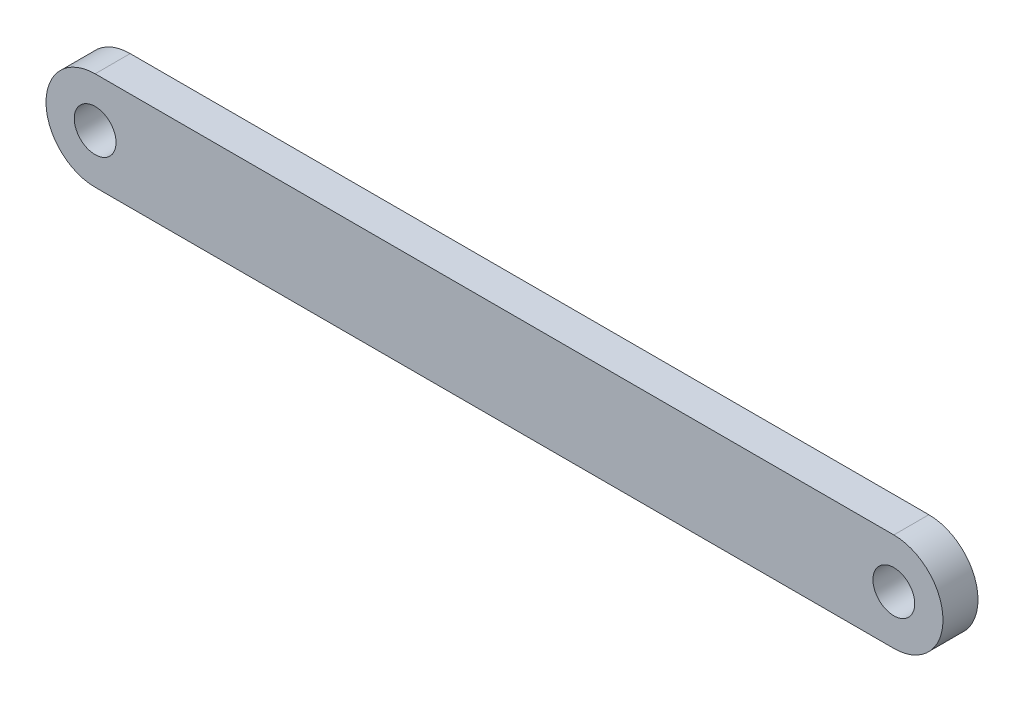
ISO-10303-21;
HEADER;
FILE_DESCRIPTION(('STEP AP214'),'2;1');
FILE_NAME('part.step','',(''),(''),'','','');
FILE_SCHEMA(('AUTOMOTIVE_DESIGN { 1 0 10303 214 1 1 1 1 }'));
ENDSEC;
DATA;
#1=APPLICATION_CONTEXT('core data for automotive mechanical design processes');
#2=APPLICATION_PROTOCOL_DEFINITION('international standard','automotive_design',2000,#1);
#3=PRODUCT_CONTEXT('',#1,'mechanical');
#4=PRODUCT('Part','Part','',(#3));
#5=PRODUCT_RELATED_PRODUCT_CATEGORY('part','',(#4));
#6=PRODUCT_DEFINITION_FORMATION('','',#4);
#7=PRODUCT_DEFINITION_CONTEXT('part definition',#1,'design');
#8=PRODUCT_DEFINITION('design','',#6,#7);
#9=PRODUCT_DEFINITION_SHAPE('','',#8);
#10=(LENGTH_UNIT() NAMED_UNIT(*) SI_UNIT(.MILLI.,.METRE.));
#11=(NAMED_UNIT(*) PLANE_ANGLE_UNIT() SI_UNIT($,.RADIAN.));
#12=(NAMED_UNIT(*) SI_UNIT($,.STERADIAN.) SOLID_ANGLE_UNIT());
#13=UNCERTAINTY_MEASURE_WITH_UNIT(LENGTH_MEASURE(1.E-05),#10,'distance_accuracy_value','');
#14=(GEOMETRIC_REPRESENTATION_CONTEXT(3) GLOBAL_UNCERTAINTY_ASSIGNED_CONTEXT((#13)) GLOBAL_UNIT_ASSIGNED_CONTEXT((#10,
#11,#12)) REPRESENTATION_CONTEXT('',''));
#15=CARTESIAN_POINT('',(0.,0.,0.));
#16=DIRECTION('',(0.,0.,1.));
#17=DIRECTION('',(1.,0.,0.));
#18=AXIS2_PLACEMENT_3D('',#15,#16,#17);
#19=CARTESIAN_POINT('',(-50.,4.,2.85));
#20=DIRECTION('',(0.,-1.,0.));
#21=DIRECTION('',(0.,0.,-1.));
#22=AXIS2_PLACEMENT_3D('',#19,#20,#21);
#23=PLANE('',#22);
#24=DIRECTION('',(0.,0.,1.));
#25=VECTOR('',#24,1.);
#26=CARTESIAN_POINT('',(-19.,4.,0.));
#27=LINE('',#26,#25);
#28=CARTESIAN_POINT('',(-19.,4.,0.));
#29=VERTEX_POINT('',#28);
#30=CARTESIAN_POINT('',(-19.,4.,2.85));
#31=VERTEX_POINT('',#30);
#32=EDGE_CURVE('E85',#29,#31,#27,.T.);
#33=ORIENTED_EDGE('',*,*,#32,.T.);
#34=DIRECTION('',(-1.,0.,0.));
#35=VECTOR('',#34,1.);
#36=CARTESIAN_POINT('',(-50.,4.,2.85));
#37=LINE('',#36,#35);
#38=CARTESIAN_POINT('',(46.,4.,2.85));
#39=VERTEX_POINT('',#38);
#40=EDGE_CURVE('E72',#39,#31,#37,.T.);
#41=ORIENTED_EDGE('',*,*,#40,.F.);
#42=DIRECTION('',(0.,0.,1.));
#43=VECTOR('',#42,1.);
#44=CARTESIAN_POINT('',(46.,4.,0.));
#45=LINE('',#44,#43);
#46=CARTESIAN_POINT('',(46.,4.,0.));
#47=VERTEX_POINT('',#46);
#48=EDGE_CURVE('E78',#47,#39,#45,.T.);
#49=ORIENTED_EDGE('',*,*,#48,.F.);
#50=DIRECTION('',(-1.,0.,0.));
#51=VECTOR('',#50,1.);
#52=CARTESIAN_POINT('',(-50.,4.,0.));
#53=LINE('',#52,#51);
#54=EDGE_CURVE('E83',#47,#29,#53,.T.);
#55=ORIENTED_EDGE('',*,*,#54,.T.);
#56=EDGE_LOOP('',(#33,#41,#49,#55));
#57=FACE_BOUND('',#56,.T.);
#58=ADVANCED_FACE('F33',(#57),#23,.F.);
#59=CARTESIAN_POINT('',(0.,0.,2.85));
#60=DIRECTION('',(0.,0.,1.));
#61=DIRECTION('',(1.,0.,0.));
#62=AXIS2_PLACEMENT_3D('',#59,#60,#61);
#63=PLANE('',#62);
#64=CARTESIAN_POINT('',(-19.,0.,2.85));
#65=DIRECTION('',(0.,0.,-1.));
#66=DIRECTION('',(1.,0.,0.));
#67=AXIS2_PLACEMENT_3D('',#64,#65,#66);
#68=CIRCLE('',#67,4.);
#69=CARTESIAN_POINT('',(-19.,-4.,2.85));
#70=VERTEX_POINT('',#69);
#71=EDGE_CURVE('E47',#70,#31,#68,.T.);
#72=ORIENTED_EDGE('',*,*,#71,.F.);
#73=DIRECTION('',(1.,0.,0.));
#74=VECTOR('',#73,1.);
#75=CARTESIAN_POINT('',(-50.,-4.,2.85));
#76=LINE('',#75,#74);
#77=CARTESIAN_POINT('',(46.,-4.,2.85));
#78=VERTEX_POINT('',#77);
#79=EDGE_CURVE('E40',#70,#78,#76,.T.);
#80=ORIENTED_EDGE('',*,*,#79,.T.);
#81=CARTESIAN_POINT('',(46.,0.,2.85));
#82=DIRECTION('',(0.,0.,-1.));
#83=DIRECTION('',(1.,0.,0.));
#84=AXIS2_PLACEMENT_3D('',#81,#82,#83);
#85=CIRCLE('',#84,4.);
#86=EDGE_CURVE('E68',#39,#78,#85,.T.);
#87=ORIENTED_EDGE('',*,*,#86,.F.);
#88=ORIENTED_EDGE('',*,*,#40,.T.);
#89=EDGE_LOOP('',(#72,#80,#87,#88));
#90=FACE_BOUND('',#89,.T.);
#91=CARTESIAN_POINT('',(-19.,0.,2.85));
#92=DIRECTION('',(0.,0.,1.));
#93=DIRECTION('',(1.,0.,0.));
#94=AXIS2_PLACEMENT_3D('',#91,#92,#93);
#95=CIRCLE('',#94,1.7);
#96=CARTESIAN_POINT('',(-17.3,0.,2.85));
#97=VERTEX_POINT('',#96);
#98=EDGE_CURVE('E107',#97,#97,#95,.T.);
#99=ORIENTED_EDGE('',*,*,#98,.F.);
#100=EDGE_LOOP('',(#99));
#101=FACE_BOUND('',#100,.T.);
#102=CARTESIAN_POINT('',(46.,0.,2.85));
#103=DIRECTION('',(0.,0.,1.));
#104=DIRECTION('',(1.,0.,0.));
#105=AXIS2_PLACEMENT_3D('',#102,#103,#104);
#106=CIRCLE('',#105,1.7);
#107=CARTESIAN_POINT('',(47.7,0.,2.85));
#108=VERTEX_POINT('',#107);
#109=EDGE_CURVE('E112',#108,#108,#106,.T.);
#110=ORIENTED_EDGE('',*,*,#109,.F.);
#111=EDGE_LOOP('',(#110));
#112=FACE_BOUND('',#111,.T.);
#113=ADVANCED_FACE('F69',(#90,#101,#112),#63,.T.);
#114=CARTESIAN_POINT('',(0.,0.,0.));
#115=DIRECTION('',(0.,0.,1.));
#116=DIRECTION('',(1.,0.,0.));
#117=AXIS2_PLACEMENT_3D('',#114,#115,#116);
#118=PLANE('',#117);
#119=CARTESIAN_POINT('',(-19.,0.,0.));
#120=DIRECTION('',(0.,0.,1.));
#121=DIRECTION('',(1.,0.,0.));
#122=AXIS2_PLACEMENT_3D('',#119,#120,#121);
#123=CIRCLE('',#122,1.7);
#124=CARTESIAN_POINT('',(-17.3,0.,0.));
#125=VERTEX_POINT('',#124);
#126=EDGE_CURVE('E109',#125,#125,#123,.T.);
#127=ORIENTED_EDGE('',*,*,#126,.T.);
#128=EDGE_LOOP('',(#127));
#129=FACE_BOUND('',#128,.T.);
#130=DIRECTION('',(1.,0.,0.));
#131=VECTOR('',#130,1.);
#132=CARTESIAN_POINT('',(-50.,-4.,0.));
#133=LINE('',#132,#131);
#134=CARTESIAN_POINT('',(-19.,-4.,0.));
#135=VERTEX_POINT('',#134);
#136=CARTESIAN_POINT('',(46.,-4.,0.));
#137=VERTEX_POINT('',#136);
#138=EDGE_CURVE('E86',#135,#137,#133,.T.);
#139=ORIENTED_EDGE('',*,*,#138,.F.);
#140=CARTESIAN_POINT('',(-19.,0.,0.));
#141=DIRECTION('',(0.,0.,-1.));
#142=DIRECTION('',(1.,0.,0.));
#143=AXIS2_PLACEMENT_3D('',#140,#141,#142);
#144=CIRCLE('',#143,4.);
#145=EDGE_CURVE('E100',#135,#29,#144,.T.);
#146=ORIENTED_EDGE('',*,*,#145,.T.);
#147=ORIENTED_EDGE('',*,*,#54,.F.);
#148=CARTESIAN_POINT('',(46.,0.,0.));
#149=DIRECTION('',(0.,0.,1.));
#150=DIRECTION('',(1.,0.,0.));
#151=AXIS2_PLACEMENT_3D('',#148,#149,#150);
#152=CIRCLE('',#151,4.);
#153=EDGE_CURVE('E11',#47,#137,#152,.F.);
#154=ORIENTED_EDGE('',*,*,#153,.T.);
#155=EDGE_LOOP('',(#139,#146,#147,#154));
#156=FACE_BOUND('',#155,.T.);
#157=CARTESIAN_POINT('',(46.,0.,0.));
#158=DIRECTION('',(0.,0.,1.));
#159=DIRECTION('',(1.,0.,0.));
#160=AXIS2_PLACEMENT_3D('',#157,#158,#159);
#161=CIRCLE('',#160,1.7);
#162=CARTESIAN_POINT('',(47.7,0.,0.));
#163=VERTEX_POINT('',#162);
#164=EDGE_CURVE('E76',#163,#163,#161,.T.);
#165=ORIENTED_EDGE('',*,*,#164,.T.);
#166=EDGE_LOOP('',(#165));
#167=FACE_BOUND('',#166,.T.);
#168=ADVANCED_FACE('F97',(#129,#156,#167),#118,.F.);
#169=CARTESIAN_POINT('',(-50.,-4.,2.85));
#170=DIRECTION('',(0.,1.,0.));
#171=DIRECTION('',(0.,0.,1.));
#172=AXIS2_PLACEMENT_3D('',#169,#170,#171);
#173=PLANE('',#172);
#174=ORIENTED_EDGE('',*,*,#79,.F.);
#175=DIRECTION('',(0.,0.,1.));
#176=VECTOR('',#175,1.);
#177=CARTESIAN_POINT('',(-19.,-4.,0.));
#178=LINE('',#177,#176);
#179=EDGE_CURVE('E103',#135,#70,#178,.T.);
#180=ORIENTED_EDGE('',*,*,#179,.F.);
#181=ORIENTED_EDGE('',*,*,#138,.T.);
#182=DIRECTION('',(0.,0.,1.));
#183=VECTOR('',#182,1.);
#184=CARTESIAN_POINT('',(46.,-4.,0.));
#185=LINE('',#184,#183);
#186=EDGE_CURVE('E75',#137,#78,#185,.T.);
#187=ORIENTED_EDGE('',*,*,#186,.T.);
#188=EDGE_LOOP('',(#174,#180,#181,#187));
#189=FACE_BOUND('',#188,.T.);
#190=ADVANCED_FACE('F128',(#189),#173,.F.);
#191=CARTESIAN_POINT('',(46.,0.,0.));
#192=DIRECTION('',(0.,0.,1.));
#193=DIRECTION('',(1.,0.,0.));
#194=AXIS2_PLACEMENT_3D('',#191,#192,#193);
#195=CYLINDRICAL_SURFACE('',#194,4.);
#196=ORIENTED_EDGE('',*,*,#86,.T.);
#197=ORIENTED_EDGE('',*,*,#186,.F.);
#198=ORIENTED_EDGE('',*,*,#153,.F.);
#199=ORIENTED_EDGE('',*,*,#48,.T.);
#200=EDGE_LOOP('',(#196,#197,#198,#199));
#201=FACE_BOUND('',#200,.T.);
#202=ADVANCED_FACE('F79',(#201),#195,.T.);
#203=CARTESIAN_POINT('',(46.,0.,0.));
#204=DIRECTION('',(0.,0.,1.));
#205=DIRECTION('',(1.,0.,0.));
#206=AXIS2_PLACEMENT_3D('',#203,#204,#205);
#207=CYLINDRICAL_SURFACE('',#206,1.7);
#208=ORIENTED_EDGE('',*,*,#164,.F.);
#209=EDGE_LOOP('',(#208));
#210=FACE_BOUND('',#209,.T.);
#211=ORIENTED_EDGE('',*,*,#109,.T.);
#212=EDGE_LOOP('',(#211));
#213=FACE_BOUND('',#212,.T.);
#214=ADVANCED_FACE('F120',(#210,#213),#207,.F.);
#215=CARTESIAN_POINT('',(-19.,0.,0.));
#216=DIRECTION('',(0.,0.,1.));
#217=DIRECTION('',(1.,0.,0.));
#218=AXIS2_PLACEMENT_3D('',#215,#216,#217);
#219=CYLINDRICAL_SURFACE('',#218,1.7);
#220=ORIENTED_EDGE('',*,*,#126,.F.);
#221=EDGE_LOOP('',(#220));
#222=FACE_BOUND('',#221,.T.);
#223=ORIENTED_EDGE('',*,*,#98,.T.);
#224=EDGE_LOOP('',(#223));
#225=FACE_BOUND('',#224,.T.);
#226=ADVANCED_FACE('F141',(#222,#225),#219,.F.);
#227=CARTESIAN_POINT('',(-19.,0.,0.));
#228=DIRECTION('',(0.,0.,1.));
#229=DIRECTION('',(1.,0.,0.));
#230=AXIS2_PLACEMENT_3D('',#227,#228,#229);
#231=CYLINDRICAL_SURFACE('',#230,4.);
#232=ORIENTED_EDGE('',*,*,#71,.T.);
#233=ORIENTED_EDGE('',*,*,#32,.F.);
#234=ORIENTED_EDGE('',*,*,#145,.F.);
#235=ORIENTED_EDGE('',*,*,#179,.T.);
#236=EDGE_LOOP('',(#232,#233,#234,#235));
#237=FACE_BOUND('',#236,.T.);
#238=ADVANCED_FACE('F139',(#237),#231,.T.);
#239=CLOSED_SHELL('',(#58,#113,#168,#190,#202,#214,#226,#238));
#240=MANIFOLD_SOLID_BREP('B2',#239);
#241=ADVANCED_BREP_SHAPE_REPRESENTATION('',(#18,#240),#14);
#242=SHAPE_DEFINITION_REPRESENTATION(#9,#241);
ENDSEC;
END-ISO-10303-21;
